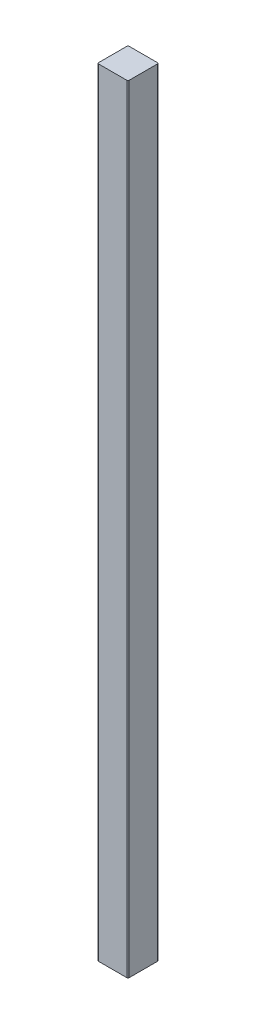
ISO-10303-21;
HEADER;
FILE_DESCRIPTION(('STEP AP214'),'2;1');
FILE_NAME('part.step','',(''),(''),'','','');
FILE_SCHEMA(('AUTOMOTIVE_DESIGN { 1 0 10303 214 1 1 1 1 }'));
ENDSEC;
DATA;
#1=APPLICATION_CONTEXT('core data for automotive mechanical design processes');
#2=APPLICATION_PROTOCOL_DEFINITION('international standard','automotive_design',2000,#1);
#3=PRODUCT_CONTEXT('',#1,'mechanical');
#4=PRODUCT('Part','Part','',(#3));
#5=PRODUCT_RELATED_PRODUCT_CATEGORY('part','',(#4));
#6=PRODUCT_DEFINITION_FORMATION('','',#4);
#7=PRODUCT_DEFINITION_CONTEXT('part definition',#1,'design');
#8=PRODUCT_DEFINITION('design','',#6,#7);
#9=PRODUCT_DEFINITION_SHAPE('','',#8);
#10=(LENGTH_UNIT() NAMED_UNIT(*) SI_UNIT(.MILLI.,.METRE.));
#11=(NAMED_UNIT(*) PLANE_ANGLE_UNIT() SI_UNIT($,.RADIAN.));
#12=(NAMED_UNIT(*) SI_UNIT($,.STERADIAN.) SOLID_ANGLE_UNIT());
#13=UNCERTAINTY_MEASURE_WITH_UNIT(LENGTH_MEASURE(1.E-05),#10,'distance_accuracy_value','');
#14=(GEOMETRIC_REPRESENTATION_CONTEXT(3) GLOBAL_UNCERTAINTY_ASSIGNED_CONTEXT((#13)) GLOBAL_UNIT_ASSIGNED_CONTEXT((#10,
#11,#12)) REPRESENTATION_CONTEXT('',''));
#15=CARTESIAN_POINT('',(0.,0.,0.));
#16=DIRECTION('',(0.,0.,1.));
#17=DIRECTION('',(1.,0.,0.));
#18=AXIS2_PLACEMENT_3D('',#15,#16,#17);
#19=CARTESIAN_POINT('',(44.45,2260.6,44.45));
#20=DIRECTION('',(-1.,0.,0.));
#21=DIRECTION('',(0.,0.,1.));
#22=AXIS2_PLACEMENT_3D('',#19,#20,#21);
#23=PLANE('',#22);
#24=DIRECTION('',(0.,0.,-1.));
#25=VECTOR('',#24,1.);
#26=CARTESIAN_POINT('',(44.45,0.,44.45));
#27=LINE('',#26,#25);
#28=CARTESIAN_POINT('',(44.45,0.,41.275));
#29=VERTEX_POINT('',#28);
#30=CARTESIAN_POINT('',(44.45,0.,-41.275));
#31=VERTEX_POINT('',#30);
#32=EDGE_CURVE('E144',#29,#31,#27,.T.);
#33=ORIENTED_EDGE('',*,*,#32,.T.);
#34=DIRECTION('',(0.,-1.,0.));
#35=VECTOR('',#34,1.);
#36=CARTESIAN_POINT('',(44.45,2260.6,-41.275));
#37=LINE('',#36,#35);
#38=CARTESIAN_POINT('',(44.45,2260.6,-41.275));
#39=VERTEX_POINT('',#38);
#40=EDGE_CURVE('E177',#31,#39,#37,.F.);
#41=ORIENTED_EDGE('',*,*,#40,.T.);
#42=DIRECTION('',(0.,0.,-1.));
#43=VECTOR('',#42,1.);
#44=CARTESIAN_POINT('',(44.45,2260.6,44.45));
#45=LINE('',#44,#43);
#46=CARTESIAN_POINT('',(44.45,2260.6,41.275));
#47=VERTEX_POINT('',#46);
#48=EDGE_CURVE('E142',#47,#39,#45,.T.);
#49=ORIENTED_EDGE('',*,*,#48,.F.);
#50=DIRECTION('',(0.,-1.,0.));
#51=VECTOR('',#50,1.);
#52=CARTESIAN_POINT('',(44.45,2260.6,41.275));
#53=LINE('',#52,#51);
#54=EDGE_CURVE('E173',#47,#29,#53,.T.);
#55=ORIENTED_EDGE('',*,*,#54,.T.);
#56=EDGE_LOOP('',(#33,#41,#49,#55));
#57=FACE_BOUND('',#56,.T.);
#58=ADVANCED_FACE('F40',(#57),#23,.F.);
#59=CARTESIAN_POINT('',(-44.45,2260.6,-44.45));
#60=DIRECTION('',(0.,0.,1.));
#61=DIRECTION('',(1.,0.,0.));
#62=AXIS2_PLACEMENT_3D('',#59,#60,#61);
#63=PLANE('',#62);
#64=DIRECTION('',(-1.,0.,0.));
#65=VECTOR('',#64,1.);
#66=CARTESIAN_POINT('',(-44.45,0.,-44.45));
#67=LINE('',#66,#65);
#68=CARTESIAN_POINT('',(41.275,0.,-44.45));
#69=VERTEX_POINT('',#68);
#70=CARTESIAN_POINT('',(-41.275,0.,-44.45));
#71=VERTEX_POINT('',#70);
#72=EDGE_CURVE('E137',#69,#71,#67,.T.);
#73=ORIENTED_EDGE('',*,*,#72,.T.);
#74=DIRECTION('',(0.,-1.,0.));
#75=VECTOR('',#74,1.);
#76=CARTESIAN_POINT('',(-41.275,2260.6,-44.45));
#77=LINE('',#76,#75);
#78=CARTESIAN_POINT('',(-41.275,2260.6,-44.45));
#79=VERTEX_POINT('',#78);
#80=EDGE_CURVE('E112',#71,#79,#77,.F.);
#81=ORIENTED_EDGE('',*,*,#80,.T.);
#82=DIRECTION('',(-1.,0.,0.));
#83=VECTOR('',#82,1.);
#84=CARTESIAN_POINT('',(-44.45,2260.6,-44.45));
#85=LINE('',#84,#83);
#86=CARTESIAN_POINT('',(41.275,2260.6,-44.45));
#87=VERTEX_POINT('',#86);
#88=EDGE_CURVE('E202',#87,#79,#85,.T.);
#89=ORIENTED_EDGE('',*,*,#88,.F.);
#90=DIRECTION('',(0.,-1.,0.));
#91=VECTOR('',#90,1.);
#92=CARTESIAN_POINT('',(41.275,2260.6,-44.45));
#93=LINE('',#92,#91);
#94=EDGE_CURVE('E118',#87,#69,#93,.T.);
#95=ORIENTED_EDGE('',*,*,#94,.T.);
#96=EDGE_LOOP('',(#73,#81,#89,#95));
#97=FACE_BOUND('',#96,.T.);
#98=ADVANCED_FACE('F227',(#97),#63,.F.);
#99=CARTESIAN_POINT('',(-44.45,2260.6,44.45));
#100=DIRECTION('',(1.,0.,0.));
#101=DIRECTION('',(0.,0.,-1.));
#102=AXIS2_PLACEMENT_3D('',#99,#100,#101);
#103=PLANE('',#102);
#104=DIRECTION('',(0.,0.,1.));
#105=VECTOR('',#104,1.);
#106=CARTESIAN_POINT('',(-44.45,2260.6,44.45));
#107=LINE('',#106,#105);
#108=CARTESIAN_POINT('',(-44.45,2260.6,-41.275));
#109=VERTEX_POINT('',#108);
#110=CARTESIAN_POINT('',(-44.45,2260.6,41.275));
#111=VERTEX_POINT('',#110);
#112=EDGE_CURVE('E127',#109,#111,#107,.T.);
#113=ORIENTED_EDGE('',*,*,#112,.F.);
#114=DIRECTION('',(0.,-1.,0.));
#115=VECTOR('',#114,1.);
#116=CARTESIAN_POINT('',(-44.45,2260.6,-41.275));
#117=LINE('',#116,#115);
#118=CARTESIAN_POINT('',(-44.45,0.,-41.275));
#119=VERTEX_POINT('',#118);
#120=EDGE_CURVE('E111',#109,#119,#117,.T.);
#121=ORIENTED_EDGE('',*,*,#120,.T.);
#122=DIRECTION('',(0.,0.,1.));
#123=VECTOR('',#122,1.);
#124=CARTESIAN_POINT('',(-44.45,0.,44.45));
#125=LINE('',#124,#123);
#126=CARTESIAN_POINT('',(-44.45,0.,41.275));
#127=VERTEX_POINT('',#126);
#128=EDGE_CURVE('E125',#119,#127,#125,.T.);
#129=ORIENTED_EDGE('',*,*,#128,.T.);
#130=DIRECTION('',(0.,-1.,0.));
#131=VECTOR('',#130,1.);
#132=CARTESIAN_POINT('',(-44.45,2260.6,41.275));
#133=LINE('',#132,#131);
#134=EDGE_CURVE('E130',#127,#111,#133,.F.);
#135=ORIENTED_EDGE('',*,*,#134,.T.);
#136=EDGE_LOOP('',(#113,#121,#129,#135));
#137=FACE_BOUND('',#136,.T.);
#138=ADVANCED_FACE('F124',(#137),#103,.F.);
#139=CARTESIAN_POINT('',(-44.45,2260.6,44.45));
#140=DIRECTION('',(0.,0.,-1.));
#141=DIRECTION('',(-1.,0.,0.));
#142=AXIS2_PLACEMENT_3D('',#139,#140,#141);
#143=PLANE('',#142);
#144=DIRECTION('',(1.,0.,0.));
#145=VECTOR('',#144,1.);
#146=CARTESIAN_POINT('',(-44.45,2260.6,44.45));
#147=LINE('',#146,#145);
#148=CARTESIAN_POINT('',(-41.275,2260.6,44.45));
#149=VERTEX_POINT('',#148);
#150=CARTESIAN_POINT('',(41.275,2260.6,44.45));
#151=VERTEX_POINT('',#150);
#152=EDGE_CURVE('E149',#149,#151,#147,.T.);
#153=ORIENTED_EDGE('',*,*,#152,.F.);
#154=DIRECTION('',(0.,-1.,0.));
#155=VECTOR('',#154,1.);
#156=CARTESIAN_POINT('',(-41.275,2260.6,44.45));
#157=LINE('',#156,#155);
#158=CARTESIAN_POINT('',(-41.275,0.,44.45));
#159=VERTEX_POINT('',#158);
#160=EDGE_CURVE('E11',#149,#159,#157,.T.);
#161=ORIENTED_EDGE('',*,*,#160,.T.);
#162=DIRECTION('',(1.,0.,0.));
#163=VECTOR('',#162,1.);
#164=CARTESIAN_POINT('',(-44.45,0.,44.45));
#165=LINE('',#164,#163);
#166=CARTESIAN_POINT('',(41.275,0.,44.45));
#167=VERTEX_POINT('',#166);
#168=EDGE_CURVE('E136',#159,#167,#165,.T.);
#169=ORIENTED_EDGE('',*,*,#168,.T.);
#170=DIRECTION('',(0.,-1.,0.));
#171=VECTOR('',#170,1.);
#172=CARTESIAN_POINT('',(41.275,2260.6,44.45));
#173=LINE('',#172,#171);
#174=EDGE_CURVE('E49',#167,#151,#173,.F.);
#175=ORIENTED_EDGE('',*,*,#174,.T.);
#176=EDGE_LOOP('',(#153,#161,#169,#175));
#177=FACE_BOUND('',#176,.T.);
#178=ADVANCED_FACE('F234',(#177),#143,.F.);
#179=CARTESIAN_POINT('',(0.,2260.6,0.));
#180=DIRECTION('',(0.,-1.,0.));
#181=DIRECTION('',(0.,0.,-1.));
#182=AXIS2_PLACEMENT_3D('',#179,#180,#181);
#183=PLANE('',#182);
#184=ORIENTED_EDGE('',*,*,#88,.T.);
#185=CARTESIAN_POINT('',(-41.275,2260.6,-41.275));
#186=DIRECTION('',(0.,-1.,0.));
#187=DIRECTION('',(0.,0.,-1.));
#188=AXIS2_PLACEMENT_3D('',#185,#186,#187);
#189=CIRCLE('',#188,3.175);
#190=EDGE_CURVE('E170',#79,#109,#189,.F.);
#191=ORIENTED_EDGE('',*,*,#190,.T.);
#192=ORIENTED_EDGE('',*,*,#112,.T.);
#193=CARTESIAN_POINT('',(-41.275,2260.6,41.275));
#194=DIRECTION('',(0.,-1.,0.));
#195=DIRECTION('',(0.,0.,-1.));
#196=AXIS2_PLACEMENT_3D('',#193,#194,#195);
#197=CIRCLE('',#196,3.175);
#198=EDGE_CURVE('E62',#111,#149,#197,.F.);
#199=ORIENTED_EDGE('',*,*,#198,.T.);
#200=ORIENTED_EDGE('',*,*,#152,.T.);
#201=CARTESIAN_POINT('',(41.275,2260.6,41.275));
#202=DIRECTION('',(0.,-1.,0.));
#203=DIRECTION('',(0.,0.,-1.));
#204=AXIS2_PLACEMENT_3D('',#201,#202,#203);
#205=CIRCLE('',#204,3.175);
#206=EDGE_CURVE('E162',#151,#47,#205,.F.);
#207=ORIENTED_EDGE('',*,*,#206,.T.);
#208=ORIENTED_EDGE('',*,*,#48,.T.);
#209=CARTESIAN_POINT('',(41.275,2260.6,-41.275));
#210=DIRECTION('',(0.,-1.,0.));
#211=DIRECTION('',(0.,0.,-1.));
#212=AXIS2_PLACEMENT_3D('',#209,#210,#211);
#213=CIRCLE('',#212,3.175);
#214=EDGE_CURVE('E167',#39,#87,#213,.F.);
#215=ORIENTED_EDGE('',*,*,#214,.T.);
#216=EDGE_LOOP('',(#184,#191,#192,#199,#200,#207,#208,#215));
#217=FACE_BOUND('',#216,.T.);
#218=ADVANCED_FACE('F225',(#217),#183,.F.);
#219=CARTESIAN_POINT('',(0.,0.,0.));
#220=DIRECTION('',(0.,-1.,0.));
#221=DIRECTION('',(0.,0.,-1.));
#222=AXIS2_PLACEMENT_3D('',#219,#220,#221);
#223=PLANE('',#222);
#224=ORIENTED_EDGE('',*,*,#128,.F.);
#225=CARTESIAN_POINT('',(-41.275,0.,-41.275));
#226=DIRECTION('',(0.,-1.,0.));
#227=DIRECTION('',(0.,0.,-1.));
#228=AXIS2_PLACEMENT_3D('',#225,#226,#227);
#229=CIRCLE('',#228,3.175);
#230=EDGE_CURVE('E107',#119,#71,#229,.T.);
#231=ORIENTED_EDGE('',*,*,#230,.T.);
#232=ORIENTED_EDGE('',*,*,#72,.F.);
#233=CARTESIAN_POINT('',(41.275,0.,-41.275));
#234=DIRECTION('',(0.,-1.,0.));
#235=DIRECTION('',(0.,0.,-1.));
#236=AXIS2_PLACEMENT_3D('',#233,#234,#235);
#237=CIRCLE('',#236,3.175);
#238=EDGE_CURVE('E119',#69,#31,#237,.T.);
#239=ORIENTED_EDGE('',*,*,#238,.T.);
#240=ORIENTED_EDGE('',*,*,#32,.F.);
#241=CARTESIAN_POINT('',(41.275,0.,41.275));
#242=DIRECTION('',(0.,-1.,0.));
#243=DIRECTION('',(0.,0.,-1.));
#244=AXIS2_PLACEMENT_3D('',#241,#242,#243);
#245=CIRCLE('',#244,3.175);
#246=EDGE_CURVE('E129',#29,#167,#245,.T.);
#247=ORIENTED_EDGE('',*,*,#246,.T.);
#248=ORIENTED_EDGE('',*,*,#168,.F.);
#249=CARTESIAN_POINT('',(-41.275,0.,41.275));
#250=DIRECTION('',(0.,-1.,0.));
#251=DIRECTION('',(0.,0.,-1.));
#252=AXIS2_PLACEMENT_3D('',#249,#250,#251);
#253=CIRCLE('',#252,3.175);
#254=EDGE_CURVE('E134',#159,#127,#253,.T.);
#255=ORIENTED_EDGE('',*,*,#254,.T.);
#256=EDGE_LOOP('',(#224,#231,#232,#239,#240,#247,#248,#255));
#257=FACE_BOUND('',#256,.T.);
#258=ADVANCED_FACE('F132',(#257),#223,.T.);
#259=CARTESIAN_POINT('',(-41.275,2260.6,-41.275));
#260=DIRECTION('',(0.,-1.,0.));
#261=DIRECTION('',(0.,0.,-1.));
#262=AXIS2_PLACEMENT_3D('',#259,#260,#261);
#263=CYLINDRICAL_SURFACE('',#262,3.175);
#264=ORIENTED_EDGE('',*,*,#190,.F.);
#265=ORIENTED_EDGE('',*,*,#80,.F.);
#266=ORIENTED_EDGE('',*,*,#230,.F.);
#267=ORIENTED_EDGE('',*,*,#120,.F.);
#268=EDGE_LOOP('',(#264,#265,#266,#267));
#269=FACE_BOUND('',#268,.T.);
#270=ADVANCED_FACE('F110',(#269),#263,.T.);
#271=CARTESIAN_POINT('',(41.275,2260.6,-41.275));
#272=DIRECTION('',(0.,-1.,0.));
#273=DIRECTION('',(0.,0.,-1.));
#274=AXIS2_PLACEMENT_3D('',#271,#272,#273);
#275=CYLINDRICAL_SURFACE('',#274,3.175);
#276=ORIENTED_EDGE('',*,*,#214,.F.);
#277=ORIENTED_EDGE('',*,*,#40,.F.);
#278=ORIENTED_EDGE('',*,*,#238,.F.);
#279=ORIENTED_EDGE('',*,*,#94,.F.);
#280=EDGE_LOOP('',(#276,#277,#278,#279));
#281=FACE_BOUND('',#280,.T.);
#282=ADVANCED_FACE('F222',(#281),#275,.T.);
#283=CARTESIAN_POINT('',(-41.275,2260.6,41.275));
#284=DIRECTION('',(0.,-1.,0.));
#285=DIRECTION('',(0.,0.,-1.));
#286=AXIS2_PLACEMENT_3D('',#283,#284,#285);
#287=CYLINDRICAL_SURFACE('',#286,3.175);
#288=ORIENTED_EDGE('',*,*,#198,.F.);
#289=ORIENTED_EDGE('',*,*,#134,.F.);
#290=ORIENTED_EDGE('',*,*,#254,.F.);
#291=ORIENTED_EDGE('',*,*,#160,.F.);
#292=EDGE_LOOP('',(#288,#289,#290,#291));
#293=FACE_BOUND('',#292,.T.);
#294=ADVANCED_FACE('F242',(#293),#287,.T.);
#295=CARTESIAN_POINT('',(41.275,2260.6,41.275));
#296=DIRECTION('',(0.,-1.,0.));
#297=DIRECTION('',(0.,0.,-1.));
#298=AXIS2_PLACEMENT_3D('',#295,#296,#297);
#299=CYLINDRICAL_SURFACE('',#298,3.175);
#300=ORIENTED_EDGE('',*,*,#206,.F.);
#301=ORIENTED_EDGE('',*,*,#174,.F.);
#302=ORIENTED_EDGE('',*,*,#246,.F.);
#303=ORIENTED_EDGE('',*,*,#54,.F.);
#304=EDGE_LOOP('',(#300,#301,#302,#303));
#305=FACE_BOUND('',#304,.T.);
#306=ADVANCED_FACE('F42',(#305),#299,.T.);
#307=CLOSED_SHELL('',(#58,#98,#138,#178,#218,#258,#270,#282,#294,#306));
#308=MANIFOLD_SOLID_BREP('B2',#307);
#309=ADVANCED_BREP_SHAPE_REPRESENTATION('',(#18,#308),#14);
#310=SHAPE_DEFINITION_REPRESENTATION(#9,#309);
ENDSEC;
END-ISO-10303-21;
